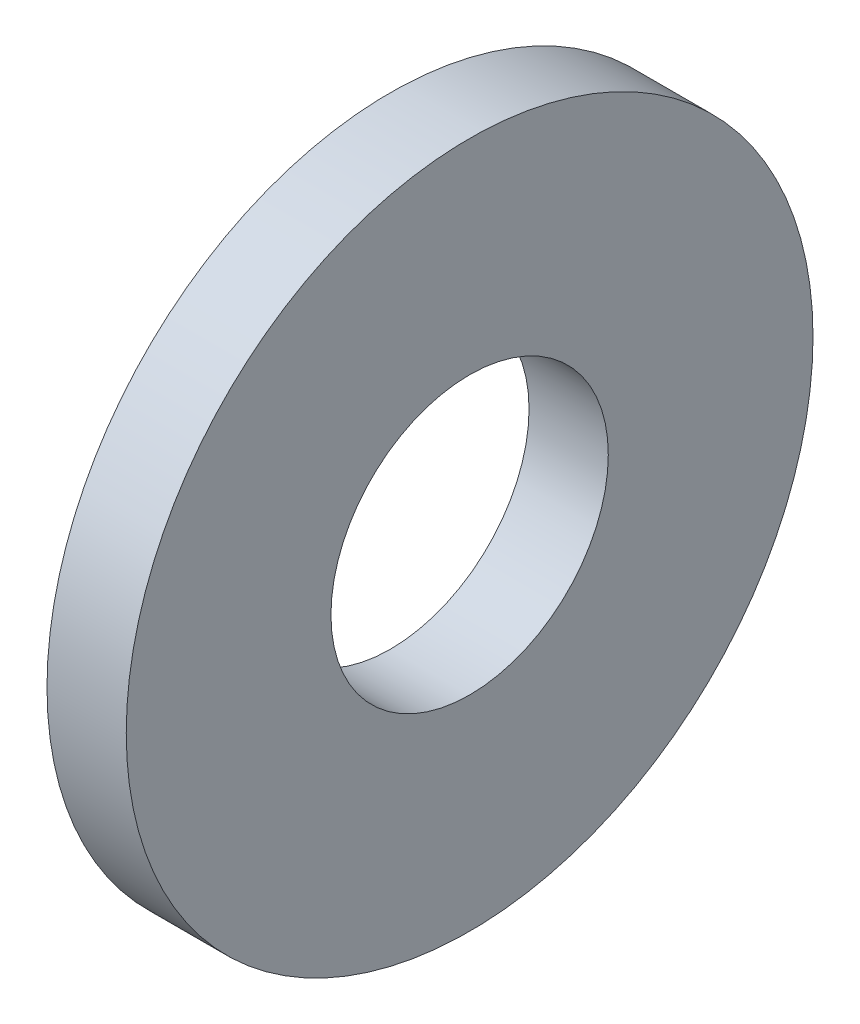
ISO-10303-21;
HEADER;
FILE_DESCRIPTION(('STEP AP214'),'2;1');
FILE_NAME('part.step','',(''),(''),'','','');
FILE_SCHEMA(('AUTOMOTIVE_DESIGN { 1 0 10303 214 1 1 1 1 }'));
ENDSEC;
DATA;
#1=APPLICATION_CONTEXT('core data for automotive mechanical design processes');
#2=APPLICATION_PROTOCOL_DEFINITION('international standard','automotive_design',2000,#1);
#3=PRODUCT_CONTEXT('',#1,'mechanical');
#4=PRODUCT('Part','Part','',(#3));
#5=PRODUCT_RELATED_PRODUCT_CATEGORY('part','',(#4));
#6=PRODUCT_DEFINITION_FORMATION('','',#4);
#7=PRODUCT_DEFINITION_CONTEXT('part definition',#1,'design');
#8=PRODUCT_DEFINITION('design','',#6,#7);
#9=PRODUCT_DEFINITION_SHAPE('','',#8);
#10=(LENGTH_UNIT() NAMED_UNIT(*) SI_UNIT(.MILLI.,.METRE.));
#11=(NAMED_UNIT(*) PLANE_ANGLE_UNIT() SI_UNIT($,.RADIAN.));
#12=(NAMED_UNIT(*) SI_UNIT($,.STERADIAN.) SOLID_ANGLE_UNIT());
#13=UNCERTAINTY_MEASURE_WITH_UNIT(LENGTH_MEASURE(1.E-05),#10,'distance_accuracy_value','');
#14=(GEOMETRIC_REPRESENTATION_CONTEXT(3) GLOBAL_UNCERTAINTY_ASSIGNED_CONTEXT((#13)) GLOBAL_UNIT_ASSIGNED_CONTEXT((#10,
#11,#12)) REPRESENTATION_CONTEXT('',''));
#15=CARTESIAN_POINT('',(0.,0.,0.));
#16=DIRECTION('',(0.,0.,1.));
#17=DIRECTION('',(1.,0.,0.));
#18=AXIS2_PLACEMENT_3D('',#15,#16,#17);
#19=CARTESIAN_POINT('',(3.,0.,0.));
#20=DIRECTION('',(1.,0.,0.));
#21=DIRECTION('',(0.,0.,-1.));
#22=AXIS2_PLACEMENT_3D('',#19,#20,#21);
#23=PLANE('',#22);
#24=CARTESIAN_POINT('',(3.,0.,0.));
#25=DIRECTION('',(1.,0.,0.));
#26=DIRECTION('',(0.,0.,-1.));
#27=AXIS2_PLACEMENT_3D('',#24,#25,#26);
#28=CIRCLE('',#27,13.);
#29=CARTESIAN_POINT('',(3.,0.,-13.));
#30=VERTEX_POINT('',#29);
#31=EDGE_CURVE('E10',#30,#30,#28,.T.);
#32=ORIENTED_EDGE('',*,*,#31,.T.);
#33=EDGE_LOOP('',(#32));
#34=FACE_BOUND('',#33,.T.);
#35=CARTESIAN_POINT('',(3.,0.,0.));
#36=DIRECTION('',(1.,0.,0.));
#37=DIRECTION('',(0.,0.,-1.));
#38=AXIS2_PLACEMENT_3D('',#35,#36,#37);
#39=CIRCLE('',#38,5.25);
#40=CARTESIAN_POINT('',(3.,0.,-5.25));
#41=VERTEX_POINT('',#40);
#42=EDGE_CURVE('E39',#41,#41,#39,.T.);
#43=ORIENTED_EDGE('',*,*,#42,.F.);
#44=EDGE_LOOP('',(#43));
#45=FACE_BOUND('',#44,.T.);
#46=ADVANCED_FACE('F28',(#34,#45),#23,.T.);
#47=CARTESIAN_POINT('',(0.,0.,0.));
#48=DIRECTION('',(1.,0.,0.));
#49=DIRECTION('',(0.,0.,-1.));
#50=AXIS2_PLACEMENT_3D('',#47,#48,#49);
#51=PLANE('',#50);
#52=CARTESIAN_POINT('',(0.,0.,0.));
#53=DIRECTION('',(1.,0.,0.));
#54=DIRECTION('',(0.,0.,-1.));
#55=AXIS2_PLACEMENT_3D('',#52,#53,#54);
#56=CIRCLE('',#55,13.);
#57=CARTESIAN_POINT('',(0.,0.,-13.));
#58=VERTEX_POINT('',#57);
#59=EDGE_CURVE('E32',#58,#58,#56,.T.);
#60=ORIENTED_EDGE('',*,*,#59,.F.);
#61=EDGE_LOOP('',(#60));
#62=FACE_BOUND('',#61,.T.);
#63=CARTESIAN_POINT('',(0.,0.,0.));
#64=DIRECTION('',(1.,0.,0.));
#65=DIRECTION('',(0.,0.,-1.));
#66=AXIS2_PLACEMENT_3D('',#63,#64,#65);
#67=CIRCLE('',#66,5.25);
#68=CARTESIAN_POINT('',(0.,0.,-5.25));
#69=VERTEX_POINT('',#68);
#70=EDGE_CURVE('E41',#69,#69,#67,.T.);
#71=ORIENTED_EDGE('',*,*,#70,.T.);
#72=EDGE_LOOP('',(#71));
#73=FACE_BOUND('',#72,.T.);
#74=ADVANCED_FACE('F51',(#62,#73),#51,.F.);
#75=CARTESIAN_POINT('',(3.,0.,0.));
#76=DIRECTION('',(-1.,0.,0.));
#77=DIRECTION('',(0.,0.,1.));
#78=AXIS2_PLACEMENT_3D('',#75,#76,#77);
#79=CYLINDRICAL_SURFACE('',#78,13.);
#80=ORIENTED_EDGE('',*,*,#31,.F.);
#81=EDGE_LOOP('',(#80));
#82=FACE_BOUND('',#81,.T.);
#83=ORIENTED_EDGE('',*,*,#59,.T.);
#84=EDGE_LOOP('',(#83));
#85=FACE_BOUND('',#84,.T.);
#86=ADVANCED_FACE('F30',(#82,#85),#79,.T.);
#87=CARTESIAN_POINT('',(3.,0.,0.));
#88=DIRECTION('',(-1.,0.,0.));
#89=DIRECTION('',(0.,0.,1.));
#90=AXIS2_PLACEMENT_3D('',#87,#88,#89);
#91=CYLINDRICAL_SURFACE('',#90,5.25);
#92=ORIENTED_EDGE('',*,*,#42,.T.);
#93=EDGE_LOOP('',(#92));
#94=FACE_BOUND('',#93,.T.);
#95=ORIENTED_EDGE('',*,*,#70,.F.);
#96=EDGE_LOOP('',(#95));
#97=FACE_BOUND('',#96,.T.);
#98=ADVANCED_FACE('F47',(#94,#97),#91,.F.);
#99=CLOSED_SHELL('',(#46,#74,#86,#98));
#100=MANIFOLD_SOLID_BREP('B2',#99);
#101=ADVANCED_BREP_SHAPE_REPRESENTATION('',(#18,#100),#14);
#102=SHAPE_DEFINITION_REPRESENTATION(#9,#101);
ENDSEC;
END-ISO-10303-21;
